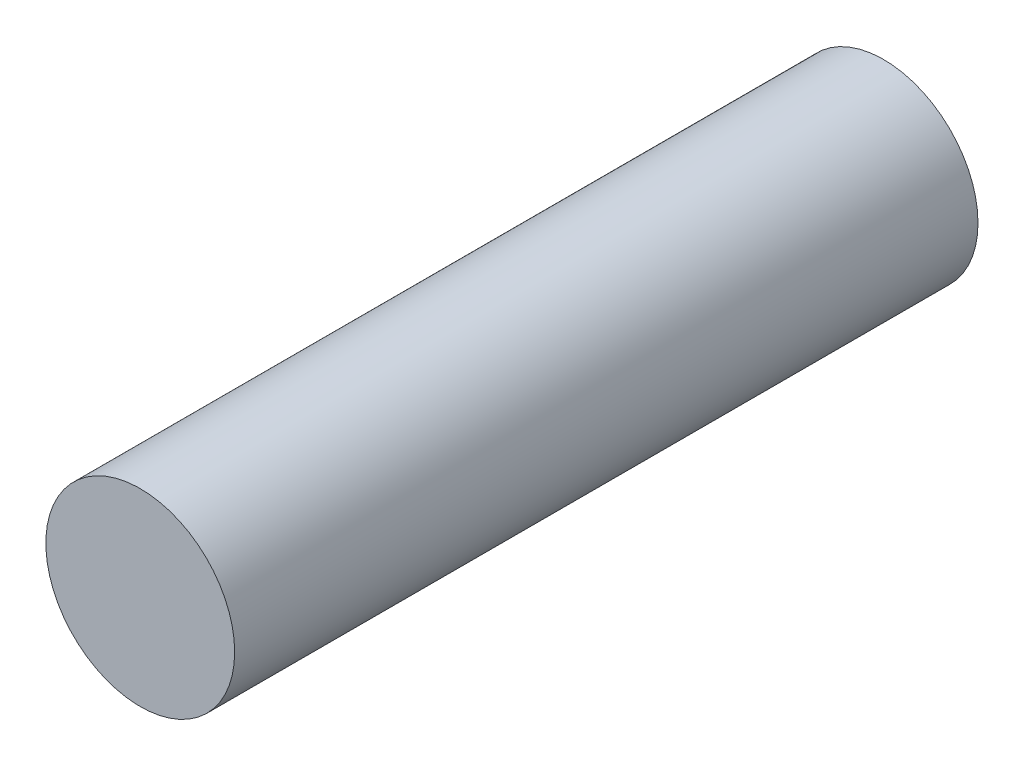
ISO-10303-21;
HEADER;
FILE_DESCRIPTION(('STEP AP214'),'2;1');
FILE_NAME('part.step','',(''),(''),'','','');
FILE_SCHEMA(('AUTOMOTIVE_DESIGN { 1 0 10303 214 1 1 1 1 }'));
ENDSEC;
DATA;
#1=APPLICATION_CONTEXT('core data for automotive mechanical design processes');
#2=APPLICATION_PROTOCOL_DEFINITION('international standard','automotive_design',2000,#1);
#3=PRODUCT_CONTEXT('',#1,'mechanical');
#4=PRODUCT('Part','Part','',(#3));
#5=PRODUCT_RELATED_PRODUCT_CATEGORY('part','',(#4));
#6=PRODUCT_DEFINITION_FORMATION('','',#4);
#7=PRODUCT_DEFINITION_CONTEXT('part definition',#1,'design');
#8=PRODUCT_DEFINITION('design','',#6,#7);
#9=PRODUCT_DEFINITION_SHAPE('','',#8);
#10=(LENGTH_UNIT() NAMED_UNIT(*) SI_UNIT(.MILLI.,.METRE.));
#11=(NAMED_UNIT(*) PLANE_ANGLE_UNIT() SI_UNIT($,.RADIAN.));
#12=(NAMED_UNIT(*) SI_UNIT($,.STERADIAN.) SOLID_ANGLE_UNIT());
#13=UNCERTAINTY_MEASURE_WITH_UNIT(LENGTH_MEASURE(1.E-05),#10,'distance_accuracy_value','');
#14=(GEOMETRIC_REPRESENTATION_CONTEXT(3) GLOBAL_UNCERTAINTY_ASSIGNED_CONTEXT((#13)) GLOBAL_UNIT_ASSIGNED_CONTEXT((#10,
#11,#12)) REPRESENTATION_CONTEXT('',''));
#15=CARTESIAN_POINT('',(0.,0.,0.));
#16=DIRECTION('',(0.,0.,1.));
#17=DIRECTION('',(1.,0.,0.));
#18=AXIS2_PLACEMENT_3D('',#15,#16,#17);
#19=CARTESIAN_POINT('',(0.,0.,600.));
#20=DIRECTION('',(0.,0.,-1.));
#21=DIRECTION('',(-1.,0.,0.));
#22=AXIS2_PLACEMENT_3D('',#19,#20,#21);
#23=CYLINDRICAL_SURFACE('',#22,76.2);
#24=CARTESIAN_POINT('',(0.,0.,600.));
#25=DIRECTION('',(0.,0.,1.));
#26=DIRECTION('',(1.,0.,0.));
#27=AXIS2_PLACEMENT_3D('',#24,#25,#26);
#28=CIRCLE('',#27,76.2);
#29=CARTESIAN_POINT('',(76.2,0.,600.));
#30=VERTEX_POINT('',#29);
#31=EDGE_CURVE('E10',#30,#30,#28,.T.);
#32=ORIENTED_EDGE('',*,*,#31,.F.);
#33=EDGE_LOOP('',(#32));
#34=FACE_BOUND('',#33,.T.);
#35=CARTESIAN_POINT('',(0.,0.,0.));
#36=DIRECTION('',(0.,0.,1.));
#37=DIRECTION('',(1.,0.,0.));
#38=AXIS2_PLACEMENT_3D('',#35,#36,#37);
#39=CIRCLE('',#38,76.2);
#40=CARTESIAN_POINT('',(76.2,0.,0.));
#41=VERTEX_POINT('',#40);
#42=EDGE_CURVE('E38',#41,#41,#39,.T.);
#43=ORIENTED_EDGE('',*,*,#42,.T.);
#44=EDGE_LOOP('',(#43));
#45=FACE_BOUND('',#44,.T.);
#46=ADVANCED_FACE('F35',(#34,#45),#23,.T.);
#47=CARTESIAN_POINT('',(0.,0.,600.));
#48=DIRECTION('',(0.,0.,1.));
#49=DIRECTION('',(1.,0.,0.));
#50=AXIS2_PLACEMENT_3D('',#47,#48,#49);
#51=PLANE('',#50);
#52=ORIENTED_EDGE('',*,*,#31,.T.);
#53=EDGE_LOOP('',(#52));
#54=FACE_BOUND('',#53,.T.);
#55=ADVANCED_FACE('F50',(#54),#51,.T.);
#56=CARTESIAN_POINT('',(0.,0.,0.));
#57=DIRECTION('',(0.,0.,1.));
#58=DIRECTION('',(1.,0.,0.));
#59=AXIS2_PLACEMENT_3D('',#56,#57,#58);
#60=PLANE('',#59);
#61=ORIENTED_EDGE('',*,*,#42,.F.);
#62=EDGE_LOOP('',(#61));
#63=FACE_BOUND('',#62,.T.);
#64=ADVANCED_FACE('F48',(#63),#60,.F.);
#65=CLOSED_SHELL('',(#46,#55,#64));
#66=MANIFOLD_SOLID_BREP('B2',#65);
#67=ADVANCED_BREP_SHAPE_REPRESENTATION('',(#18,#66),#14);
#68=SHAPE_DEFINITION_REPRESENTATION(#9,#67);
ENDSEC;
END-ISO-10303-21;
